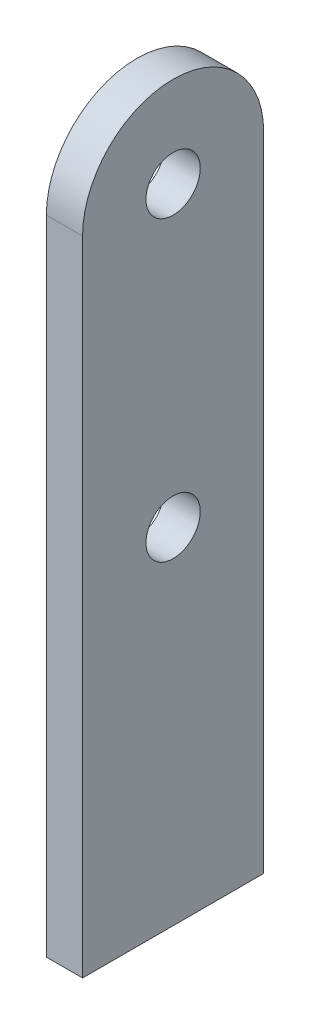
ISO-10303-21;
HEADER;
FILE_DESCRIPTION(('STEP AP214'),'2;1');
FILE_NAME('part.step','',(''),(''),'','','');
FILE_SCHEMA(('AUTOMOTIVE_DESIGN { 1 0 10303 214 1 1 1 1 }'));
ENDSEC;
DATA;
#1=APPLICATION_CONTEXT('core data for automotive mechanical design processes');
#2=APPLICATION_PROTOCOL_DEFINITION('international standard','automotive_design',2000,#1);
#3=PRODUCT_CONTEXT('',#1,'mechanical');
#4=PRODUCT('Part','Part','',(#3));
#5=PRODUCT_RELATED_PRODUCT_CATEGORY('part','',(#4));
#6=PRODUCT_DEFINITION_FORMATION('','',#4);
#7=PRODUCT_DEFINITION_CONTEXT('part definition',#1,'design');
#8=PRODUCT_DEFINITION('design','',#6,#7);
#9=PRODUCT_DEFINITION_SHAPE('','',#8);
#10=(LENGTH_UNIT() NAMED_UNIT(*) SI_UNIT(.MILLI.,.METRE.));
#11=(NAMED_UNIT(*) PLANE_ANGLE_UNIT() SI_UNIT($,.RADIAN.));
#12=(NAMED_UNIT(*) SI_UNIT($,.STERADIAN.) SOLID_ANGLE_UNIT());
#13=UNCERTAINTY_MEASURE_WITH_UNIT(LENGTH_MEASURE(1.E-05),#10,'distance_accuracy_value','');
#14=(GEOMETRIC_REPRESENTATION_CONTEXT(3) GLOBAL_UNCERTAINTY_ASSIGNED_CONTEXT((#13)) GLOBAL_UNIT_ASSIGNED_CONTEXT((#10,
#11,#12)) REPRESENTATION_CONTEXT('',''));
#15=CARTESIAN_POINT('',(0.,0.,0.));
#16=DIRECTION('',(0.,0.,1.));
#17=DIRECTION('',(1.,0.,0.));
#18=AXIS2_PLACEMENT_3D('',#15,#16,#17);
#19=CARTESIAN_POINT('',(10.,177.43174,0.));
#20=DIRECTION('',(1.,0.,0.));
#21=DIRECTION('',(0.,0.,-1.));
#22=AXIS2_PLACEMENT_3D('',#19,#20,#21);
#23=PLANE('',#22);
#24=CARTESIAN_POINT('',(10.,95.2901012,0.));
#25=DIRECTION('',(1.,0.,0.));
#26=DIRECTION('',(0.,0.,-1.));
#27=AXIS2_PLACEMENT_3D('',#24,#25,#26);
#28=CIRCLE('',#27,7.5);
#29=CARTESIAN_POINT('',(10.,95.2901012,-7.5));
#30=VERTEX_POINT('',#29);
#31=EDGE_CURVE('E99',#30,#30,#28,.T.);
#32=ORIENTED_EDGE('',*,*,#31,.F.);
#33=EDGE_LOOP('',(#32));
#34=FACE_BOUND('',#33,.T.);
#35=CARTESIAN_POINT('',(10.,177.43174,0.));
#36=DIRECTION('',(1.,0.,0.));
#37=DIRECTION('',(0.,0.,-1.));
#38=AXIS2_PLACEMENT_3D('',#35,#36,#37);
#39=CIRCLE('',#38,25.);
#40=CARTESIAN_POINT('',(10.,177.43174,-25.));
#41=VERTEX_POINT('',#40);
#42=CARTESIAN_POINT('',(10.,177.43174,25.));
#43=VERTEX_POINT('',#42);
#44=EDGE_CURVE('E84',#41,#43,#39,.T.);
#45=ORIENTED_EDGE('',*,*,#44,.T.);
#46=DIRECTION('',(0.,-1.,0.));
#47=VECTOR('',#46,1.);
#48=CARTESIAN_POINT('',(10.,177.43174,25.));
#49=LINE('',#48,#47);
#50=CARTESIAN_POINT('',(10.,0.,25.));
#51=VERTEX_POINT('',#50);
#52=EDGE_CURVE('E79',#43,#51,#49,.T.);
#53=ORIENTED_EDGE('',*,*,#52,.T.);
#54=DIRECTION('',(0.,0.,-1.));
#55=VECTOR('',#54,1.);
#56=CARTESIAN_POINT('',(10.,0.,25.));
#57=LINE('',#56,#55);
#58=CARTESIAN_POINT('',(10.,0.,-25.));
#59=VERTEX_POINT('',#58);
#60=EDGE_CURVE('E82',#51,#59,#57,.T.);
#61=ORIENTED_EDGE('',*,*,#60,.T.);
#62=DIRECTION('',(0.,1.,0.));
#63=VECTOR('',#62,1.);
#64=CARTESIAN_POINT('',(10.,177.43174,-25.));
#65=LINE('',#64,#63);
#66=EDGE_CURVE('E49',#59,#41,#65,.T.);
#67=ORIENTED_EDGE('',*,*,#66,.T.);
#68=EDGE_LOOP('',(#45,#53,#61,#67));
#69=FACE_BOUND('',#68,.T.);
#70=CARTESIAN_POINT('',(10.,177.43174,0.));
#71=DIRECTION('',(1.,0.,0.));
#72=DIRECTION('',(0.,0.,-1.));
#73=AXIS2_PLACEMENT_3D('',#70,#71,#72);
#74=CIRCLE('',#73,7.5);
#75=CARTESIAN_POINT('',(10.,177.43174,-7.5));
#76=VERTEX_POINT('',#75);
#77=EDGE_CURVE('E114',#76,#76,#74,.T.);
#78=ORIENTED_EDGE('',*,*,#77,.F.);
#79=EDGE_LOOP('',(#78));
#80=FACE_BOUND('',#79,.T.);
#81=ADVANCED_FACE('F32',(#34,#69,#80),#23,.T.);
#82=CARTESIAN_POINT('',(0.,177.43174,0.));
#83=DIRECTION('',(1.,0.,0.));
#84=DIRECTION('',(0.,0.,-1.));
#85=AXIS2_PLACEMENT_3D('',#82,#83,#84);
#86=PLANE('',#85);
#87=CARTESIAN_POINT('',(0.,177.43174,0.));
#88=DIRECTION('',(1.,0.,0.));
#89=DIRECTION('',(0.,0.,-1.));
#90=AXIS2_PLACEMENT_3D('',#87,#88,#89);
#91=CIRCLE('',#90,25.);
#92=CARTESIAN_POINT('',(0.,177.43174,-25.));
#93=VERTEX_POINT('',#92);
#94=CARTESIAN_POINT('',(0.,177.43174,25.));
#95=VERTEX_POINT('',#94);
#96=EDGE_CURVE('E96',#93,#95,#91,.T.);
#97=ORIENTED_EDGE('',*,*,#96,.F.);
#98=DIRECTION('',(0.,1.,0.));
#99=VECTOR('',#98,1.);
#100=CARTESIAN_POINT('',(0.,177.43174,-25.));
#101=LINE('',#100,#99);
#102=CARTESIAN_POINT('',(0.,0.,-25.));
#103=VERTEX_POINT('',#102);
#104=EDGE_CURVE('E72',#103,#93,#101,.T.);
#105=ORIENTED_EDGE('',*,*,#104,.F.);
#106=DIRECTION('',(0.,0.,-1.));
#107=VECTOR('',#106,1.);
#108=CARTESIAN_POINT('',(0.,0.,25.));
#109=LINE('',#108,#107);
#110=CARTESIAN_POINT('',(0.,0.,25.));
#111=VERTEX_POINT('',#110);
#112=EDGE_CURVE('E66',#111,#103,#109,.T.);
#113=ORIENTED_EDGE('',*,*,#112,.F.);
#114=DIRECTION('',(0.,-1.,0.));
#115=VECTOR('',#114,1.);
#116=CARTESIAN_POINT('',(0.,177.43174,25.));
#117=LINE('',#116,#115);
#118=EDGE_CURVE('E88',#95,#111,#117,.T.);
#119=ORIENTED_EDGE('',*,*,#118,.F.);
#120=EDGE_LOOP('',(#97,#105,#113,#119));
#121=FACE_BOUND('',#120,.T.);
#122=CARTESIAN_POINT('',(0.,95.2901012,0.));
#123=DIRECTION('',(1.,0.,0.));
#124=DIRECTION('',(0.,0.,-1.));
#125=AXIS2_PLACEMENT_3D('',#122,#123,#124);
#126=CIRCLE('',#125,7.5);
#127=CARTESIAN_POINT('',(0.,95.2901012,-7.5));
#128=VERTEX_POINT('',#127);
#129=EDGE_CURVE('E111',#128,#128,#126,.T.);
#130=ORIENTED_EDGE('',*,*,#129,.T.);
#131=EDGE_LOOP('',(#130));
#132=FACE_BOUND('',#131,.T.);
#133=CARTESIAN_POINT('',(0.,177.43174,0.));
#134=DIRECTION('',(1.,0.,0.));
#135=DIRECTION('',(0.,0.,-1.));
#136=AXIS2_PLACEMENT_3D('',#133,#134,#135);
#137=CIRCLE('',#136,7.5);
#138=CARTESIAN_POINT('',(0.,177.43174,-7.5));
#139=VERTEX_POINT('',#138);
#140=EDGE_CURVE('E117',#139,#139,#137,.T.);
#141=ORIENTED_EDGE('',*,*,#140,.T.);
#142=EDGE_LOOP('',(#141));
#143=FACE_BOUND('',#142,.T.);
#144=ADVANCED_FACE('F107',(#121,#132,#143),#86,.F.);
#145=CARTESIAN_POINT('',(10.,177.43174,0.));
#146=DIRECTION('',(-1.,0.,0.));
#147=DIRECTION('',(0.,0.,1.));
#148=AXIS2_PLACEMENT_3D('',#145,#146,#147);
#149=CYLINDRICAL_SURFACE('',#148,25.);
#150=ORIENTED_EDGE('',*,*,#96,.T.);
#151=DIRECTION('',(-1.,0.,0.));
#152=VECTOR('',#151,1.);
#153=CARTESIAN_POINT('',(10.,177.43174,25.));
#154=LINE('',#153,#152);
#155=EDGE_CURVE('E11',#43,#95,#154,.T.);
#156=ORIENTED_EDGE('',*,*,#155,.F.);
#157=ORIENTED_EDGE('',*,*,#44,.F.);
#158=DIRECTION('',(-1.,0.,0.));
#159=VECTOR('',#158,1.);
#160=CARTESIAN_POINT('',(10.,177.43174,-25.));
#161=LINE('',#160,#159);
#162=EDGE_CURVE('E92',#41,#93,#161,.T.);
#163=ORIENTED_EDGE('',*,*,#162,.T.);
#164=EDGE_LOOP('',(#150,#156,#157,#163));
#165=FACE_BOUND('',#164,.T.);
#166=ADVANCED_FACE('F34',(#165),#149,.T.);
#167=CARTESIAN_POINT('',(10.,177.43174,25.));
#168=DIRECTION('',(0.,0.,-1.));
#169=DIRECTION('',(0.,1.,0.));
#170=AXIS2_PLACEMENT_3D('',#167,#168,#169);
#171=PLANE('',#170);
#172=ORIENTED_EDGE('',*,*,#118,.T.);
#173=DIRECTION('',(-1.,0.,0.));
#174=VECTOR('',#173,1.);
#175=CARTESIAN_POINT('',(10.,0.,25.));
#176=LINE('',#175,#174);
#177=EDGE_CURVE('E41',#51,#111,#176,.T.);
#178=ORIENTED_EDGE('',*,*,#177,.F.);
#179=ORIENTED_EDGE('',*,*,#52,.F.);
#180=ORIENTED_EDGE('',*,*,#155,.T.);
#181=EDGE_LOOP('',(#172,#178,#179,#180));
#182=FACE_BOUND('',#181,.T.);
#183=ADVANCED_FACE('F87',(#182),#171,.F.);
#184=CARTESIAN_POINT('',(10.,0.,25.));
#185=DIRECTION('',(0.,1.,0.));
#186=DIRECTION('',(0.,0.,1.));
#187=AXIS2_PLACEMENT_3D('',#184,#185,#186);
#188=PLANE('',#187);
#189=ORIENTED_EDGE('',*,*,#112,.T.);
#190=DIRECTION('',(-1.,0.,0.));
#191=VECTOR('',#190,1.);
#192=CARTESIAN_POINT('',(10.,0.,-25.));
#193=LINE('',#192,#191);
#194=EDGE_CURVE('E89',#59,#103,#193,.T.);
#195=ORIENTED_EDGE('',*,*,#194,.F.);
#196=ORIENTED_EDGE('',*,*,#60,.F.);
#197=ORIENTED_EDGE('',*,*,#177,.T.);
#198=EDGE_LOOP('',(#189,#195,#196,#197));
#199=FACE_BOUND('',#198,.T.);
#200=ADVANCED_FACE('F90',(#199),#188,.F.);
#201=CARTESIAN_POINT('',(10.,177.43174,-25.));
#202=DIRECTION('',(0.,0.,1.));
#203=DIRECTION('',(0.,-1.,0.));
#204=AXIS2_PLACEMENT_3D('',#201,#202,#203);
#205=PLANE('',#204);
#206=ORIENTED_EDGE('',*,*,#104,.T.);
#207=ORIENTED_EDGE('',*,*,#162,.F.);
#208=ORIENTED_EDGE('',*,*,#66,.F.);
#209=ORIENTED_EDGE('',*,*,#194,.T.);
#210=EDGE_LOOP('',(#206,#207,#208,#209));
#211=FACE_BOUND('',#210,.T.);
#212=ADVANCED_FACE('F104',(#211),#205,.F.);
#213=CARTESIAN_POINT('',(10.,95.2901012,0.));
#214=DIRECTION('',(-1.,0.,0.));
#215=DIRECTION('',(0.,0.,1.));
#216=AXIS2_PLACEMENT_3D('',#213,#214,#215);
#217=CYLINDRICAL_SURFACE('',#216,7.5);
#218=ORIENTED_EDGE('',*,*,#31,.T.);
#219=EDGE_LOOP('',(#218));
#220=FACE_BOUND('',#219,.T.);
#221=ORIENTED_EDGE('',*,*,#129,.F.);
#222=EDGE_LOOP('',(#221));
#223=FACE_BOUND('',#222,.T.);
#224=ADVANCED_FACE('F134',(#220,#223),#217,.F.);
#225=CARTESIAN_POINT('',(10.,177.43174,0.));
#226=DIRECTION('',(-1.,0.,0.));
#227=DIRECTION('',(0.,0.,1.));
#228=AXIS2_PLACEMENT_3D('',#225,#226,#227);
#229=CYLINDRICAL_SURFACE('',#228,7.5);
#230=ORIENTED_EDGE('',*,*,#77,.T.);
#231=EDGE_LOOP('',(#230));
#232=FACE_BOUND('',#231,.T.);
#233=ORIENTED_EDGE('',*,*,#140,.F.);
#234=EDGE_LOOP('',(#233));
#235=FACE_BOUND('',#234,.T.);
#236=ADVANCED_FACE('F123',(#232,#235),#229,.F.);
#237=CLOSED_SHELL('',(#81,#144,#166,#183,#200,#212,#224,#236));
#238=MANIFOLD_SOLID_BREP('B2',#237);
#239=ADVANCED_BREP_SHAPE_REPRESENTATION('',(#18,#238),#14);
#240=SHAPE_DEFINITION_REPRESENTATION(#9,#239);
ENDSEC;
END-ISO-10303-21;
